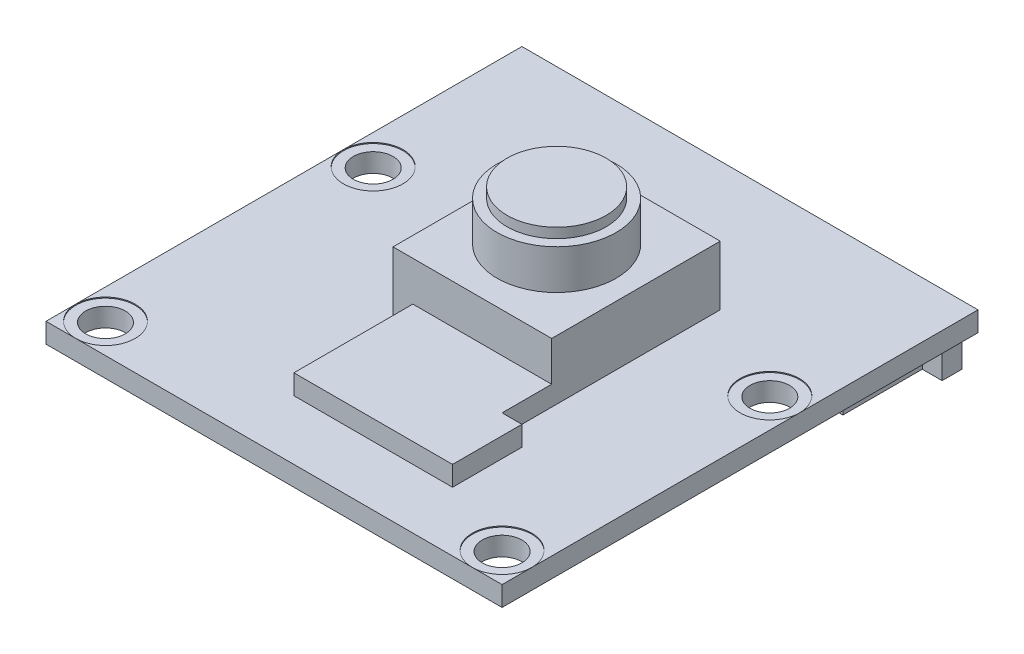
ISO-10303-21;
HEADER;
FILE_DESCRIPTION(('STEP AP214'),'2;1');
FILE_NAME('part.step','',(''),(''),'','','');
FILE_SCHEMA(('AUTOMOTIVE_DESIGN { 1 0 10303 214 1 1 1 1 }'));
ENDSEC;
DATA;
#1=APPLICATION_CONTEXT('core data for automotive mechanical design processes');
#2=APPLICATION_PROTOCOL_DEFINITION('international standard','automotive_design',2000,#1);
#3=PRODUCT_CONTEXT('',#1,'mechanical');
#4=PRODUCT('Part','Part','',(#3));
#5=PRODUCT_RELATED_PRODUCT_CATEGORY('part','',(#4));
#6=PRODUCT_DEFINITION_FORMATION('','',#4);
#7=PRODUCT_DEFINITION_CONTEXT('part definition',#1,'design');
#8=PRODUCT_DEFINITION('design','',#6,#7);
#9=PRODUCT_DEFINITION_SHAPE('','',#8);
#10=(LENGTH_UNIT() NAMED_UNIT(*) SI_UNIT(.MILLI.,.METRE.));
#11=(NAMED_UNIT(*) PLANE_ANGLE_UNIT() SI_UNIT($,.RADIAN.));
#12=(NAMED_UNIT(*) SI_UNIT($,.STERADIAN.) SOLID_ANGLE_UNIT());
#13=UNCERTAINTY_MEASURE_WITH_UNIT(LENGTH_MEASURE(1.E-05),#10,'distance_accuracy_value','');
#14=(GEOMETRIC_REPRESENTATION_CONTEXT(3) GLOBAL_UNCERTAINTY_ASSIGNED_CONTEXT((#13)) GLOBAL_UNIT_ASSIGNED_CONTEXT((#10,
#11,#12)) REPRESENTATION_CONTEXT('',''));
#15=CARTESIAN_POINT('',(0.,0.,0.));
#16=DIRECTION('',(0.,0.,1.));
#17=DIRECTION('',(1.,0.,0.));
#18=AXIS2_PLACEMENT_3D('',#15,#16,#17);
#19=CARTESIAN_POINT('',(21.1997439515811,0.01,-19.));
#20=DIRECTION('',(0.,0.,1.));
#21=DIRECTION('',(-1.,0.,0.));
#22=AXIS2_PLACEMENT_3D('',#19,#20,#21);
#23=PLANE('',#22);
#24=DIRECTION('',(-1.,0.,0.));
#25=VECTOR('',#24,1.);
#26=CARTESIAN_POINT('',(11.5948719757906,-2.,-19.));
#27=LINE('',#26,#25);
#28=CARTESIAN_POINT('',(21.1897439515812,-2.,-19.));
#29=VERTEX_POINT('',#28);
#30=CARTESIAN_POINT('',(1.68974395158116,-2.,-19.));
#31=VERTEX_POINT('',#30);
#32=EDGE_CURVE('P0_E118',#29,#31,#27,.T.);
#33=ORIENTED_EDGE('',*,*,#32,.F.);
#34=DIRECTION('',(0.,-1.,0.));
#35=VECTOR('',#34,1.);
#36=CARTESIAN_POINT('',(21.1897439515812,-1.,-19.));
#37=LINE('',#36,#35);
#38=CARTESIAN_POINT('',(21.1897439515812,0.,-19.));
#39=VERTEX_POINT('',#38);
#40=EDGE_CURVE('P0_E90',#39,#29,#37,.T.);
#41=ORIENTED_EDGE('',*,*,#40,.F.);
#42=DIRECTION('',(1.,0.,0.));
#43=VECTOR('',#42,1.);
#44=CARTESIAN_POINT('',(11.5948719757906,0.,-19.));
#45=LINE('',#44,#43);
#46=CARTESIAN_POINT('',(1.68974395158115,0.,-19.));
#47=VERTEX_POINT('',#46);
#48=EDGE_CURVE('P0_E96',#47,#39,#45,.T.);
#49=ORIENTED_EDGE('',*,*,#48,.F.);
#50=DIRECTION('',(0.,1.,0.));
#51=VECTOR('',#50,1.);
#52=CARTESIAN_POINT('',(1.68974395158116,-1.,-19.));
#53=LINE('',#52,#51);
#54=EDGE_CURVE('P0_E20',#31,#47,#53,.T.);
#55=ORIENTED_EDGE('',*,*,#54,.F.);
#56=EDGE_LOOP('',(#33,#41,#49,#55));
#57=FACE_BOUND('',#56,.T.);
#58=ADVANCED_FACE('P0_F16',(#57),#23,.T.);
#59=CARTESIAN_POINT('',(1.68974395158116,0.01,-18.99));
#60=DIRECTION('',(-1.,0.,0.));
#61=DIRECTION('',(0.,0.,-1.));
#62=AXIS2_PLACEMENT_3D('',#59,#60,#61);
#63=PLANE('',#62);
#64=DIRECTION('',(0.,0.,-1.));
#65=VECTOR('',#64,1.);
#66=CARTESIAN_POINT('',(1.68974395158116,-2.,-21.5));
#67=LINE('',#66,#65);
#68=CARTESIAN_POINT('',(1.68974395158116,-2.,-23.));
#69=VERTEX_POINT('',#68);
#70=EDGE_CURVE('P0_E120',#31,#69,#67,.T.);
#71=ORIENTED_EDGE('',*,*,#70,.F.);
#72=ORIENTED_EDGE('',*,*,#54,.T.);
#73=DIRECTION('',(0.,0.,1.));
#74=VECTOR('',#73,1.);
#75=CARTESIAN_POINT('',(1.68974395158115,0.,-21.5));
#76=LINE('',#75,#74);
#77=CARTESIAN_POINT('',(1.68974395158115,0.,-23.));
#78=VERTEX_POINT('',#77);
#79=EDGE_CURVE('P0_E92',#78,#47,#76,.T.);
#80=ORIENTED_EDGE('',*,*,#79,.F.);
#81=DIRECTION('',(0.,1.,0.));
#82=VECTOR('',#81,1.);
#83=CARTESIAN_POINT('',(1.68974395158116,-1.,-23.));
#84=LINE('',#83,#82);
#85=EDGE_CURVE('P0_E82',#69,#78,#84,.T.);
#86=ORIENTED_EDGE('',*,*,#85,.F.);
#87=EDGE_LOOP('',(#71,#72,#80,#86));
#88=FACE_BOUND('',#87,.T.);
#89=ADVANCED_FACE('P0_F93',(#88),#63,.T.);
#90=CARTESIAN_POINT('',(1.69974395158116,0.01,-23.));
#91=DIRECTION('',(0.,0.,1.));
#92=DIRECTION('',(-1.,0.,0.));
#93=AXIS2_PLACEMENT_3D('',#90,#91,#92);
#94=PLANE('',#93);
#95=DIRECTION('',(-1.,0.,0.));
#96=VECTOR('',#95,1.);
#97=CARTESIAN_POINT('',(11.5948719757906,-2.,-23.));
#98=LINE('',#97,#96);
#99=CARTESIAN_POINT('',(1.,-2.,-23.));
#100=VERTEX_POINT('',#99);
#101=EDGE_CURVE('P0_E88',#69,#100,#98,.T.);
#102=ORIENTED_EDGE('',*,*,#101,.F.);
#103=ORIENTED_EDGE('',*,*,#85,.T.);
#104=DIRECTION('',(1.,0.,0.));
#105=VECTOR('',#104,1.);
#106=CARTESIAN_POINT('',(11.5948719757906,0.,-23.));
#107=LINE('',#106,#105);
#108=CARTESIAN_POINT('',(1.,0.,-23.));
#109=VERTEX_POINT('',#108);
#110=EDGE_CURVE('P0_E86',#109,#78,#107,.T.);
#111=ORIENTED_EDGE('',*,*,#110,.F.);
#112=DIRECTION('',(0.,1.,0.));
#113=VECTOR('',#112,1.);
#114=CARTESIAN_POINT('',(1.,-1.,-23.));
#115=LINE('',#114,#113);
#116=EDGE_CURVE('P0_E137',#100,#109,#115,.T.);
#117=ORIENTED_EDGE('',*,*,#116,.F.);
#118=EDGE_LOOP('',(#102,#103,#111,#117));
#119=FACE_BOUND('',#118,.T.);
#120=ADVANCED_FACE('P0_F83',(#119),#94,.T.);
#121=CARTESIAN_POINT('',(21.1897439515812,0.01,-23.01));
#122=DIRECTION('',(1.,0.,0.));
#123=DIRECTION('',(0.,0.,1.));
#124=AXIS2_PLACEMENT_3D('',#121,#122,#123);
#125=PLANE('',#124);
#126=DIRECTION('',(0.,0.,1.));
#127=VECTOR('',#126,1.);
#128=CARTESIAN_POINT('',(21.1897439515812,-2.,-21.5));
#129=LINE('',#128,#127);
#130=CARTESIAN_POINT('',(21.1897439515812,-2.,-23.));
#131=VERTEX_POINT('',#130);
#132=EDGE_CURVE('P0_E113',#131,#29,#129,.T.);
#133=ORIENTED_EDGE('',*,*,#132,.F.);
#134=DIRECTION('',(0.,-1.,0.));
#135=VECTOR('',#134,1.);
#136=CARTESIAN_POINT('',(21.1897439515812,-1.,-23.));
#137=LINE('',#136,#135);
#138=CARTESIAN_POINT('',(21.1897439515812,0.,-23.));
#139=VERTEX_POINT('',#138);
#140=EDGE_CURVE('P0_E133',#139,#131,#137,.T.);
#141=ORIENTED_EDGE('',*,*,#140,.F.);
#142=DIRECTION('',(0.,0.,-1.));
#143=VECTOR('',#142,1.);
#144=CARTESIAN_POINT('',(21.1897439515812,0.,-21.5));
#145=LINE('',#144,#143);
#146=EDGE_CURVE('P0_E115',#39,#139,#145,.T.);
#147=ORIENTED_EDGE('',*,*,#146,.F.);
#148=ORIENTED_EDGE('',*,*,#40,.T.);
#149=EDGE_LOOP('',(#133,#141,#147,#148));
#150=FACE_BOUND('',#149,.T.);
#151=ADVANCED_FACE('P0_F110',(#150),#125,.T.);
#152=CARTESIAN_POINT('',(22.1997439515812,0.,-24.01));
#153=DIRECTION('',(0.,1.,0.));
#154=DIRECTION('',(-1.,0.,0.));
#155=AXIS2_PLACEMENT_3D('',#152,#153,#154);
#156=PLANE('',#155);
#157=ORIENTED_EDGE('',*,*,#48,.T.);
#158=ORIENTED_EDGE('',*,*,#146,.T.);
#159=DIRECTION('',(-1.,0.,0.));
#160=VECTOR('',#159,1.);
#161=CARTESIAN_POINT('',(21.6897439515812,0.,-23.));
#162=LINE('',#161,#160);
#163=CARTESIAN_POINT('',(22.1897439515812,0.,-23.));
#164=VERTEX_POINT('',#163);
#165=EDGE_CURVE('P0_E131',#164,#139,#162,.T.);
#166=ORIENTED_EDGE('',*,*,#165,.F.);
#167=DIRECTION('',(0.,0.,-1.));
#168=VECTOR('',#167,1.);
#169=CARTESIAN_POINT('',(22.1897439515812,0.,-21.5));
#170=LINE('',#169,#168);
#171=CARTESIAN_POINT('',(22.1897439515812,0.,-24.));
#172=VERTEX_POINT('',#171);
#173=EDGE_CURVE('P0_E102',#164,#172,#170,.T.);
#174=ORIENTED_EDGE('',*,*,#173,.T.);
#175=DIRECTION('',(1.,0.,0.));
#176=VECTOR('',#175,1.);
#177=CARTESIAN_POINT('',(11.5948719757906,0.,-24.));
#178=LINE('',#177,#176);
#179=CARTESIAN_POINT('',(1.,0.,-24.));
#180=VERTEX_POINT('',#179);
#181=EDGE_CURVE('P0_E159',#180,#172,#178,.T.);
#182=ORIENTED_EDGE('',*,*,#181,.F.);
#183=DIRECTION('',(0.,0.,-1.));
#184=VECTOR('',#183,1.);
#185=CARTESIAN_POINT('',(1.,0.,-23.5));
#186=LINE('',#185,#184);
#187=EDGE_CURVE('P0_E100',#109,#180,#186,.T.);
#188=ORIENTED_EDGE('',*,*,#187,.F.);
#189=ORIENTED_EDGE('',*,*,#110,.T.);
#190=ORIENTED_EDGE('',*,*,#79,.T.);
#191=EDGE_LOOP('',(#157,#158,#166,#174,#182,#188,#189,#190));
#192=FACE_BOUND('',#191,.T.);
#193=ADVANCED_FACE('P0_F98',(#192),#156,.T.);
#194=CARTESIAN_POINT('',(0.990000000000003,-2.,-18.99));
#195=DIRECTION('',(0.,-1.,0.));
#196=DIRECTION('',(0.,0.,-1.));
#197=AXIS2_PLACEMENT_3D('',#194,#195,#196);
#198=PLANE('',#197);
#199=DIRECTION('',(-1.,0.,0.));
#200=VECTOR('',#199,1.);
#201=CARTESIAN_POINT('',(11.5948719757906,-2.,-24.));
#202=LINE('',#201,#200);
#203=CARTESIAN_POINT('',(22.1897439515812,-2.,-24.));
#204=VERTEX_POINT('',#203);
#205=CARTESIAN_POINT('',(1.,-2.,-24.));
#206=VERTEX_POINT('',#205);
#207=EDGE_CURVE('P0_E155',#204,#206,#202,.T.);
#208=ORIENTED_EDGE('',*,*,#207,.F.);
#209=DIRECTION('',(0.,0.,1.));
#210=VECTOR('',#209,1.);
#211=CARTESIAN_POINT('',(22.1897439515812,-2.,-21.5));
#212=LINE('',#211,#210);
#213=CARTESIAN_POINT('',(22.1897439515812,-2.,-23.));
#214=VERTEX_POINT('',#213);
#215=EDGE_CURVE('P0_E34',#204,#214,#212,.T.);
#216=ORIENTED_EDGE('',*,*,#215,.T.);
#217=DIRECTION('',(1.,0.,0.));
#218=VECTOR('',#217,1.);
#219=CARTESIAN_POINT('',(21.6897439515812,-2.,-23.));
#220=LINE('',#219,#218);
#221=EDGE_CURVE('P0_E124',#131,#214,#220,.T.);
#222=ORIENTED_EDGE('',*,*,#221,.F.);
#223=ORIENTED_EDGE('',*,*,#132,.T.);
#224=ORIENTED_EDGE('',*,*,#32,.T.);
#225=ORIENTED_EDGE('',*,*,#70,.T.);
#226=ORIENTED_EDGE('',*,*,#101,.T.);
#227=DIRECTION('',(0.,0.,1.));
#228=VECTOR('',#227,1.);
#229=CARTESIAN_POINT('',(1.,-2.,-23.5));
#230=LINE('',#229,#228);
#231=EDGE_CURVE('P0_E139',#206,#100,#230,.T.);
#232=ORIENTED_EDGE('',*,*,#231,.F.);
#233=EDGE_LOOP('',(#208,#216,#222,#223,#224,#225,#226,#232));
#234=FACE_BOUND('',#233,.T.);
#235=ADVANCED_FACE('P0_F122',(#234),#198,.T.);
#236=CARTESIAN_POINT('',(1.,0.01,-22.99));
#237=DIRECTION('',(-1.,0.,0.));
#238=DIRECTION('',(0.,0.,-1.));
#239=AXIS2_PLACEMENT_3D('',#236,#237,#238);
#240=PLANE('',#239);
#241=ORIENTED_EDGE('',*,*,#231,.T.);
#242=ORIENTED_EDGE('',*,*,#116,.T.);
#243=ORIENTED_EDGE('',*,*,#187,.T.);
#244=DIRECTION('',(0.,1.,0.));
#245=VECTOR('',#244,1.);
#246=CARTESIAN_POINT('',(1.,-1.,-24.));
#247=LINE('',#246,#245);
#248=EDGE_CURVE('P0_E151',#206,#180,#247,.T.);
#249=ORIENTED_EDGE('',*,*,#248,.F.);
#250=EDGE_LOOP('',(#241,#242,#243,#249));
#251=FACE_BOUND('',#250,.T.);
#252=ADVANCED_FACE('P0_F149',(#251),#240,.T.);
#253=CARTESIAN_POINT('',(22.1997439515812,0.01,-23.));
#254=DIRECTION('',(0.,0.,1.));
#255=DIRECTION('',(-1.,0.,0.));
#256=AXIS2_PLACEMENT_3D('',#253,#254,#255);
#257=PLANE('',#256);
#258=ORIENTED_EDGE('',*,*,#221,.T.);
#259=DIRECTION('',(0.,-1.,0.));
#260=VECTOR('',#259,1.);
#261=CARTESIAN_POINT('',(22.1897439515812,-1.,-23.));
#262=LINE('',#261,#260);
#263=EDGE_CURVE('P0_E26',#164,#214,#262,.T.);
#264=ORIENTED_EDGE('',*,*,#263,.F.);
#265=ORIENTED_EDGE('',*,*,#165,.T.);
#266=ORIENTED_EDGE('',*,*,#140,.T.);
#267=EDGE_LOOP('',(#258,#264,#265,#266));
#268=FACE_BOUND('',#267,.T.);
#269=ADVANCED_FACE('P0_F136',(#268),#257,.T.);
#270=CARTESIAN_POINT('',(0.99,0.01,-24.));
#271=DIRECTION('',(0.,0.,-1.));
#272=DIRECTION('',(1.,0.,0.));
#273=AXIS2_PLACEMENT_3D('',#270,#271,#272);
#274=PLANE('',#273);
#275=ORIENTED_EDGE('',*,*,#207,.T.);
#276=ORIENTED_EDGE('',*,*,#248,.T.);
#277=ORIENTED_EDGE('',*,*,#181,.T.);
#278=DIRECTION('',(0.,1.,0.));
#279=VECTOR('',#278,1.);
#280=CARTESIAN_POINT('',(22.1897439515812,-1.,-24.));
#281=LINE('',#280,#279);
#282=EDGE_CURVE('P0_E10',#204,#172,#281,.T.);
#283=ORIENTED_EDGE('',*,*,#282,.F.);
#284=EDGE_LOOP('',(#275,#276,#277,#283));
#285=FACE_BOUND('',#284,.T.);
#286=ADVANCED_FACE('P0_F158',(#285),#274,.T.);
#287=CARTESIAN_POINT('',(22.1897439515812,0.01,-24.01));
#288=DIRECTION('',(1.,0.,0.));
#289=DIRECTION('',(0.,0.,1.));
#290=AXIS2_PLACEMENT_3D('',#287,#288,#289);
#291=PLANE('',#290);
#292=ORIENTED_EDGE('',*,*,#215,.F.);
#293=ORIENTED_EDGE('',*,*,#282,.T.);
#294=ORIENTED_EDGE('',*,*,#173,.F.);
#295=ORIENTED_EDGE('',*,*,#263,.T.);
#296=EDGE_LOOP('',(#292,#293,#294,#295));
#297=FACE_BOUND('',#296,.T.);
#298=ADVANCED_FACE('P0_F18',(#297),#291,.T.);
#299=CLOSED_SHELL('',(#58,#89,#120,#151,#193,#235,#252,#269,#286,#298));
#300=MANIFOLD_SOLID_BREP('P0_B1',#299);
#301=CARTESIAN_POINT('',(15.01,6.50000000000001,-15.76));
#302=DIRECTION('',(0.,1.,0.));
#303=DIRECTION('',(-1.,0.,0.));
#304=AXIS2_PLACEMENT_3D('',#301,#302,#303);
#305=PLANE('',#304);
#306=CARTESIAN_POINT('',(12.5,6.50000000000001,-13.25));
#307=DIRECTION('',(0.,-1.,0.));
#308=DIRECTION('',(0.,0.,-1.));
#309=AXIS2_PLACEMENT_3D('',#306,#307,#308);
#310=CIRCLE('',#309,2.49999999999999);
#311=CARTESIAN_POINT('',(12.5,6.50000000000001,-15.75));
#312=VERTEX_POINT('',#311);
#313=EDGE_CURVE('P1_E21',#312,#312,#310,.T.);
#314=ORIENTED_EDGE('',*,*,#313,.F.);
#315=EDGE_LOOP('',(#314));
#316=FACE_BOUND('',#315,.T.);
#317=ADVANCED_FACE('P1_F17',(#316),#305,.T.);
#318=CARTESIAN_POINT('',(12.5,6.50000000000001,-13.25));
#319=DIRECTION('',(0.,-1.,0.));
#320=DIRECTION('',(0.,0.,-1.));
#321=AXIS2_PLACEMENT_3D('',#318,#319,#320);
#322=CYLINDRICAL_SURFACE('',#321,2.49999999999999);
#323=CARTESIAN_POINT('',(12.5,6.,-13.25));
#324=DIRECTION('',(0.,-1.,0.));
#325=DIRECTION('',(0.,0.,-1.));
#326=AXIS2_PLACEMENT_3D('',#323,#324,#325);
#327=CIRCLE('',#326,2.49999999999999);
#328=CARTESIAN_POINT('',(12.5,6.,-15.75));
#329=VERTEX_POINT('',#328);
#330=EDGE_CURVE('P1_E305',#329,#329,#327,.T.);
#331=ORIENTED_EDGE('',*,*,#330,.F.);
#332=EDGE_LOOP('',(#331));
#333=FACE_BOUND('',#332,.T.);
#334=ORIENTED_EDGE('',*,*,#313,.T.);
#335=EDGE_LOOP('',(#334));
#336=FACE_BOUND('',#335,.T.);
#337=ADVANCED_FACE('P1_F312',(#333,#336),#322,.T.);
#338=CARTESIAN_POINT('',(15.51,6.,-16.26));
#339=DIRECTION('',(0.,1.,0.));
#340=DIRECTION('',(-1.,0.,0.));
#341=AXIS2_PLACEMENT_3D('',#338,#339,#340);
#342=PLANE('',#341);
#343=ORIENTED_EDGE('',*,*,#330,.T.);
#344=EDGE_LOOP('',(#343));
#345=FACE_BOUND('',#344,.T.);
#346=CARTESIAN_POINT('',(12.5,6.,-13.25));
#347=DIRECTION('',(0.,-1.,0.));
#348=DIRECTION('',(0.,0.,-1.));
#349=AXIS2_PLACEMENT_3D('',#346,#347,#348);
#350=CIRCLE('',#349,3.);
#351=CARTESIAN_POINT('',(12.5,6.,-16.25));
#352=VERTEX_POINT('',#351);
#353=EDGE_CURVE('P1_E264',#352,#352,#350,.T.);
#354=ORIENTED_EDGE('',*,*,#353,.F.);
#355=EDGE_LOOP('',(#354));
#356=FACE_BOUND('',#355,.T.);
#357=ADVANCED_FACE('P1_F320',(#345,#356),#342,.T.);
#358=CARTESIAN_POINT('',(12.5,6.,-13.25));
#359=DIRECTION('',(0.,-1.,0.));
#360=DIRECTION('',(0.,0.,-1.));
#361=AXIS2_PLACEMENT_3D('',#358,#359,#360);
#362=CYLINDRICAL_SURFACE('',#361,3.);
#363=CARTESIAN_POINT('',(12.5,4.,-13.25));
#364=DIRECTION('',(0.,-1.,0.));
#365=DIRECTION('',(0.,0.,-1.));
#366=AXIS2_PLACEMENT_3D('',#363,#364,#365);
#367=CIRCLE('',#366,3.);
#368=CARTESIAN_POINT('',(12.5,4.,-16.25));
#369=VERTEX_POINT('',#368);
#370=EDGE_CURVE('P1_E258',#369,#369,#367,.T.);
#371=ORIENTED_EDGE('',*,*,#370,.F.);
#372=EDGE_LOOP('',(#371));
#373=FACE_BOUND('',#372,.T.);
#374=ORIENTED_EDGE('',*,*,#353,.T.);
#375=EDGE_LOOP('',(#374));
#376=FACE_BOUND('',#375,.T.);
#377=ADVANCED_FACE('P1_F549',(#373,#376),#362,.T.);
#378=CARTESIAN_POINT('',(9.48999999999999,2.,-9.01));
#379=DIRECTION('',(0.,1.,0.));
#380=DIRECTION('',(0.,0.,1.));
#381=AXIS2_PLACEMENT_3D('',#378,#379,#380);
#382=PLANE('',#381);
#383=DIRECTION('',(1.,0.,0.));
#384=VECTOR('',#383,1.);
#385=CARTESIAN_POINT('',(17.,2.,-6.50000000000001));
#386=LINE('',#385,#384);
#387=CARTESIAN_POINT('',(16.5,2.,-6.50000000000001));
#388=VERTEX_POINT('',#387);
#389=CARTESIAN_POINT('',(17.5,2.,-6.50000000000001));
#390=VERTEX_POINT('',#389);
#391=EDGE_CURVE('P1_E245',#388,#390,#386,.T.);
#392=ORIENTED_EDGE('',*,*,#391,.F.);
#393=DIRECTION('',(0.,0.,1.));
#394=VECTOR('',#393,1.);
#395=CARTESIAN_POINT('',(16.5,2.,-12.));
#396=LINE('',#395,#394);
#397=CARTESIAN_POINT('',(16.5,2.,-8.99999999999999));
#398=VERTEX_POINT('',#397);
#399=EDGE_CURVE('P1_E250',#398,#388,#396,.T.);
#400=ORIENTED_EDGE('',*,*,#399,.F.);
#401=DIRECTION('',(1.,0.,0.));
#402=VECTOR('',#401,1.);
#403=CARTESIAN_POINT('',(12.5,2.,-8.99999999999999));
#404=LINE('',#403,#402);
#405=CARTESIAN_POINT('',(9.5,2.,-8.99999999999999));
#406=VERTEX_POINT('',#405);
#407=EDGE_CURVE('P1_E263',#406,#398,#404,.T.);
#408=ORIENTED_EDGE('',*,*,#407,.F.);
#409=DIRECTION('',(0.,0.,-1.));
#410=VECTOR('',#409,1.);
#411=CARTESIAN_POINT('',(9.5,2.,-6.));
#412=LINE('',#411,#410);
#413=CARTESIAN_POINT('',(9.5,2.,-2.99999999999999));
#414=VERTEX_POINT('',#413);
#415=EDGE_CURVE('P1_E229',#414,#406,#412,.T.);
#416=ORIENTED_EDGE('',*,*,#415,.F.);
#417=DIRECTION('',(-1.,0.,0.));
#418=VECTOR('',#417,1.);
#419=CARTESIAN_POINT('',(13.5,2.,-2.99999999999999));
#420=LINE('',#419,#418);
#421=CARTESIAN_POINT('',(17.5,2.,-2.99999999999999));
#422=VERTEX_POINT('',#421);
#423=EDGE_CURVE('P1_E235',#422,#414,#420,.T.);
#424=ORIENTED_EDGE('',*,*,#423,.F.);
#425=DIRECTION('',(0.,0.,1.));
#426=VECTOR('',#425,1.);
#427=CARTESIAN_POINT('',(17.5,2.,-4.75));
#428=LINE('',#427,#426);
#429=EDGE_CURVE('P1_E240',#390,#422,#428,.T.);
#430=ORIENTED_EDGE('',*,*,#429,.F.);
#431=EDGE_LOOP('',(#392,#400,#408,#416,#424,#430));
#432=FACE_BOUND('',#431,.T.);
#433=ADVANCED_FACE('P1_F432',(#432),#382,.T.);
#434=CARTESIAN_POINT('',(8.49,0.99,-8.99999999999999));
#435=DIRECTION('',(0.,0.,1.));
#436=DIRECTION('',(1.,0.,0.));
#437=AXIS2_PLACEMENT_3D('',#434,#435,#436);
#438=PLANE('',#437);
#439=DIRECTION('',(1.,0.,0.));
#440=VECTOR('',#439,1.);
#441=CARTESIAN_POINT('',(12.5,1.,-9.));
#442=LINE('',#441,#440);
#443=CARTESIAN_POINT('',(8.49999999999999,1.,-8.99999999999999));
#444=VERTEX_POINT('',#443);
#445=CARTESIAN_POINT('',(9.5,1.,-8.99999999999999));
#446=VERTEX_POINT('',#445);
#447=EDGE_CURVE('P1_E261',#444,#446,#442,.T.);
#448=ORIENTED_EDGE('',*,*,#447,.T.);
#449=DIRECTION('',(0.,-1.,0.));
#450=VECTOR('',#449,1.);
#451=CARTESIAN_POINT('',(9.5,1.5,-8.99999999999999));
#452=LINE('',#451,#450);
#453=EDGE_CURVE('P1_E226',#406,#446,#452,.T.);
#454=ORIENTED_EDGE('',*,*,#453,.F.);
#455=ORIENTED_EDGE('',*,*,#407,.T.);
#456=DIRECTION('',(0.,-1.,0.));
#457=VECTOR('',#456,1.);
#458=CARTESIAN_POINT('',(16.5,2.50000000000001,-8.99999999999999));
#459=LINE('',#458,#457);
#460=CARTESIAN_POINT('',(16.5,4.,-8.99999999999999));
#461=VERTEX_POINT('',#460);
#462=EDGE_CURVE('P1_E252',#461,#398,#459,.T.);
#463=ORIENTED_EDGE('',*,*,#462,.F.);
#464=DIRECTION('',(1.,0.,0.));
#465=VECTOR('',#464,1.);
#466=CARTESIAN_POINT('',(12.5,4.,-8.99999999999999));
#467=LINE('',#466,#465);
#468=CARTESIAN_POINT('',(8.49999999999999,4.,-8.99999999999999));
#469=VERTEX_POINT('',#468);
#470=EDGE_CURVE('P1_E259',#469,#461,#467,.T.);
#471=ORIENTED_EDGE('',*,*,#470,.F.);
#472=DIRECTION('',(0.,1.,0.));
#473=VECTOR('',#472,1.);
#474=CARTESIAN_POINT('',(8.49999999999999,2.50000000000001,-8.99999999999999));
#475=LINE('',#474,#473);
#476=EDGE_CURVE('P1_E223',#444,#469,#475,.T.);
#477=ORIENTED_EDGE('',*,*,#476,.F.);
#478=EDGE_LOOP('',(#448,#454,#455,#463,#471,#477));
#479=FACE_BOUND('',#478,.T.);
#480=ADVANCED_FACE('P1_F417',(#479),#438,.T.);
#481=CARTESIAN_POINT('',(8.49,4.,-17.51));
#482=DIRECTION('',(0.,1.,0.));
#483=DIRECTION('',(0.,0.,1.));
#484=AXIS2_PLACEMENT_3D('',#481,#482,#483);
#485=PLANE('',#484);
#486=ORIENTED_EDGE('',*,*,#370,.T.);
#487=EDGE_LOOP('',(#486));
#488=FACE_BOUND('',#487,.T.);
#489=ORIENTED_EDGE('',*,*,#470,.T.);
#490=DIRECTION('',(0.,0.,1.));
#491=VECTOR('',#490,1.);
#492=CARTESIAN_POINT('',(16.5,4.,-12.));
#493=LINE('',#492,#491);
#494=CARTESIAN_POINT('',(16.5,4.,-17.5));
#495=VERTEX_POINT('',#494);
#496=EDGE_CURVE('P1_E255',#495,#461,#493,.T.);
#497=ORIENTED_EDGE('',*,*,#496,.F.);
#498=DIRECTION('',(1.,0.,0.));
#499=VECTOR('',#498,1.);
#500=CARTESIAN_POINT('',(12.5,4.,-17.5));
#501=LINE('',#500,#499);
#502=CARTESIAN_POINT('',(8.49999999999999,4.,-17.5));
#503=VERTEX_POINT('',#502);
#504=EDGE_CURVE('P1_E215',#503,#495,#501,.T.);
#505=ORIENTED_EDGE('',*,*,#504,.F.);
#506=DIRECTION('',(0.,0.,-1.));
#507=VECTOR('',#506,1.);
#508=CARTESIAN_POINT('',(8.49999999999999,4.,-13.25));
#509=LINE('',#508,#507);
#510=EDGE_CURVE('P1_E221',#469,#503,#509,.T.);
#511=ORIENTED_EDGE('',*,*,#510,.F.);
#512=EDGE_LOOP('',(#489,#497,#505,#511));
#513=FACE_BOUND('',#512,.T.);
#514=ADVANCED_FACE('P1_F421',(#488,#513),#485,.T.);
#515=CARTESIAN_POINT('',(1.5,1.,-15.));
#516=DIRECTION('',(0.,-1.,0.));
#517=DIRECTION('',(0.,0.,-1.));
#518=AXIS2_PLACEMENT_3D('',#515,#516,#517);
#519=CYLINDRICAL_SURFACE('',#518,1.49999999999999);
#520=CARTESIAN_POINT('',(1.5,0.95,-15.));
#521=DIRECTION('',(0.,-1.,0.));
#522=DIRECTION('',(0.,0.,-1.));
#523=AXIS2_PLACEMENT_3D('',#520,#521,#522);
#524=CIRCLE('',#523,1.49999999999999);
#525=CARTESIAN_POINT('',(1.5,0.95,-16.5));
#526=VERTEX_POINT('',#525);
#527=EDGE_CURVE('P1_E294',#526,#526,#524,.F.);
#528=ORIENTED_EDGE('',*,*,#527,.F.);
#529=EDGE_LOOP('',(#528));
#530=FACE_BOUND('',#529,.T.);
#531=CARTESIAN_POINT('',(1.5,1.,-15.));
#532=DIRECTION('',(0.,-1.,0.));
#533=DIRECTION('',(0.,0.,-1.));
#534=AXIS2_PLACEMENT_3D('',#531,#532,#533);
#535=CIRCLE('',#534,1.49999999999999);
#536=CARTESIAN_POINT('',(0.,1.,-15.));
#537=VERTEX_POINT('',#536);
#538=EDGE_CURVE('P1_E122',#537,#537,#535,.T.);
#539=ORIENTED_EDGE('',*,*,#538,.F.);
#540=EDGE_LOOP('',(#539));
#541=FACE_BOUND('',#540,.T.);
#542=ADVANCED_FACE('P1_F423',(#530,#541),#519,.F.);
#543=CARTESIAN_POINT('',(21.5,1.,-15.));
#544=DIRECTION('',(0.,-1.,0.));
#545=DIRECTION('',(0.,0.,-1.));
#546=AXIS2_PLACEMENT_3D('',#543,#544,#545);
#547=CYLINDRICAL_SURFACE('',#546,1.49999999999999);
#548=CARTESIAN_POINT('',(21.5,0.95,-15.));
#549=DIRECTION('',(0.,-1.,0.));
#550=DIRECTION('',(0.,0.,-1.));
#551=AXIS2_PLACEMENT_3D('',#548,#549,#550);
#552=CIRCLE('',#551,1.49999999999999);
#553=CARTESIAN_POINT('',(21.5,0.95,-16.5));
#554=VERTEX_POINT('',#553);
#555=EDGE_CURVE('P1_E297',#554,#554,#552,.F.);
#556=ORIENTED_EDGE('',*,*,#555,.F.);
#557=EDGE_LOOP('',(#556));
#558=FACE_BOUND('',#557,.T.);
#559=CARTESIAN_POINT('',(21.5,1.,-15.));
#560=DIRECTION('',(0.,-1.,0.));
#561=DIRECTION('',(0.,0.,-1.));
#562=AXIS2_PLACEMENT_3D('',#559,#560,#561);
#563=CIRCLE('',#562,1.49999999999999);
#564=CARTESIAN_POINT('',(23.,1.,-15.));
#565=VERTEX_POINT('',#564);
#566=EDGE_CURVE('P1_E115',#565,#565,#563,.T.);
#567=ORIENTED_EDGE('',*,*,#566,.F.);
#568=EDGE_LOOP('',(#567));
#569=FACE_BOUND('',#568,.T.);
#570=ADVANCED_FACE('P1_F117',(#558,#569),#547,.F.);
#571=CARTESIAN_POINT('',(16.5,0.99,-6.49));
#572=DIRECTION('',(1.,0.,0.));
#573=DIRECTION('',(0.,0.,-1.));
#574=AXIS2_PLACEMENT_3D('',#571,#572,#573);
#575=PLANE('',#574);
#576=ORIENTED_EDGE('',*,*,#399,.T.);
#577=DIRECTION('',(0.,1.,0.));
#578=VECTOR('',#577,1.);
#579=CARTESIAN_POINT('',(16.5,1.5,-6.50000000000001));
#580=LINE('',#579,#578);
#581=CARTESIAN_POINT('',(16.5,1.,-6.50000000000001));
#582=VERTEX_POINT('',#581);
#583=EDGE_CURVE('P1_E247',#582,#388,#580,.T.);
#584=ORIENTED_EDGE('',*,*,#583,.F.);
#585=DIRECTION('',(0.,0.,1.));
#586=VECTOR('',#585,1.);
#587=CARTESIAN_POINT('',(16.5,1.,-12.));
#588=LINE('',#587,#586);
#589=CARTESIAN_POINT('',(16.5,1.,-17.5));
#590=VERTEX_POINT('',#589);
#591=EDGE_CURVE('P1_E121',#590,#582,#588,.T.);
#592=ORIENTED_EDGE('',*,*,#591,.F.);
#593=DIRECTION('',(0.,-1.,0.));
#594=VECTOR('',#593,1.);
#595=CARTESIAN_POINT('',(16.5,2.50000000000001,-17.5));
#596=LINE('',#595,#594);
#597=EDGE_CURVE('P1_E211',#495,#590,#596,.T.);
#598=ORIENTED_EDGE('',*,*,#597,.F.);
#599=ORIENTED_EDGE('',*,*,#496,.T.);
#600=ORIENTED_EDGE('',*,*,#462,.T.);
#601=EDGE_LOOP('',(#576,#584,#592,#598,#599,#600));
#602=FACE_BOUND('',#601,.T.);
#603=ADVANCED_FACE('P1_F398',(#602),#575,.T.);
#604=CARTESIAN_POINT('',(17.51,0.99,-6.50000000000001));
#605=DIRECTION('',(0.,0.,-1.));
#606=DIRECTION('',(-1.,0.,0.));
#607=AXIS2_PLACEMENT_3D('',#604,#605,#606);
#608=PLANE('',#607);
#609=ORIENTED_EDGE('',*,*,#391,.T.);
#610=DIRECTION('',(0.,1.,0.));
#611=VECTOR('',#610,1.);
#612=CARTESIAN_POINT('',(17.5,1.5,-6.50000000000001));
#613=LINE('',#612,#611);
#614=CARTESIAN_POINT('',(17.5,1.,-6.50000000000001));
#615=VERTEX_POINT('',#614);
#616=EDGE_CURVE('P1_E242',#615,#390,#613,.T.);
#617=ORIENTED_EDGE('',*,*,#616,.F.);
#618=DIRECTION('',(1.,0.,0.));
#619=VECTOR('',#618,1.);
#620=CARTESIAN_POINT('',(11.5,1.,-6.50000000000001));
#621=LINE('',#620,#619);
#622=EDGE_CURVE('P1_E167',#582,#615,#621,.T.);
#623=ORIENTED_EDGE('',*,*,#622,.F.);
#624=ORIENTED_EDGE('',*,*,#583,.T.);
#625=EDGE_LOOP('',(#609,#617,#623,#624));
#626=FACE_BOUND('',#625,.T.);
#627=ADVANCED_FACE('P1_F402',(#626),#608,.T.);
#628=CARTESIAN_POINT('',(17.5,0.99,-2.99));
#629=DIRECTION('',(1.,0.,0.));
#630=DIRECTION('',(0.,0.,-1.));
#631=AXIS2_PLACEMENT_3D('',#628,#629,#630);
#632=PLANE('',#631);
#633=ORIENTED_EDGE('',*,*,#429,.T.);
#634=DIRECTION('',(0.,1.,0.));
#635=VECTOR('',#634,1.);
#636=CARTESIAN_POINT('',(17.5,1.5,-2.99999999999999));
#637=LINE('',#636,#635);
#638=CARTESIAN_POINT('',(17.5,1.,-2.99999999999999));
#639=VERTEX_POINT('',#638);
#640=EDGE_CURVE('P1_E237',#639,#422,#637,.T.);
#641=ORIENTED_EDGE('',*,*,#640,.F.);
#642=DIRECTION('',(0.,0.,1.));
#643=VECTOR('',#642,1.);
#644=CARTESIAN_POINT('',(17.5,1.,-12.));
#645=LINE('',#644,#643);
#646=EDGE_CURVE('P1_E164',#615,#639,#645,.T.);
#647=ORIENTED_EDGE('',*,*,#646,.F.);
#648=ORIENTED_EDGE('',*,*,#616,.T.);
#649=EDGE_LOOP('',(#633,#641,#647,#648));
#650=FACE_BOUND('',#649,.T.);
#651=ADVANCED_FACE('P1_F406',(#650),#632,.T.);
#652=CARTESIAN_POINT('',(9.48999999999999,0.99,-2.99999999999999));
#653=DIRECTION('',(0.,0.,1.));
#654=DIRECTION('',(1.,0.,0.));
#655=AXIS2_PLACEMENT_3D('',#652,#653,#654);
#656=PLANE('',#655);
#657=ORIENTED_EDGE('',*,*,#423,.T.);
#658=DIRECTION('',(0.,1.,0.));
#659=VECTOR('',#658,1.);
#660=CARTESIAN_POINT('',(9.5,1.5,-2.99999999999999));
#661=LINE('',#660,#659);
#662=CARTESIAN_POINT('',(9.5,1.,-2.99999999999999));
#663=VERTEX_POINT('',#662);
#664=EDGE_CURVE('P1_E232',#663,#414,#661,.T.);
#665=ORIENTED_EDGE('',*,*,#664,.F.);
#666=DIRECTION('',(-1.,0.,0.));
#667=VECTOR('',#666,1.);
#668=CARTESIAN_POINT('',(11.5,1.,-2.99999999999998));
#669=LINE('',#668,#667);
#670=EDGE_CURVE('P1_E161',#639,#663,#669,.T.);
#671=ORIENTED_EDGE('',*,*,#670,.F.);
#672=ORIENTED_EDGE('',*,*,#640,.T.);
#673=EDGE_LOOP('',(#657,#665,#671,#672));
#674=FACE_BOUND('',#673,.T.);
#675=ADVANCED_FACE('P1_F410',(#674),#656,.T.);
#676=CARTESIAN_POINT('',(9.5,0.99,-9.01));
#677=DIRECTION('',(-1.,0.,0.));
#678=DIRECTION('',(0.,0.,1.));
#679=AXIS2_PLACEMENT_3D('',#676,#677,#678);
#680=PLANE('',#679);
#681=ORIENTED_EDGE('',*,*,#415,.T.);
#682=ORIENTED_EDGE('',*,*,#453,.T.);
#683=DIRECTION('',(0.,0.,-1.));
#684=VECTOR('',#683,1.);
#685=CARTESIAN_POINT('',(9.5,1.,-12.));
#686=LINE('',#685,#684);
#687=EDGE_CURVE('P1_E158',#663,#446,#686,.T.);
#688=ORIENTED_EDGE('',*,*,#687,.F.);
#689=ORIENTED_EDGE('',*,*,#664,.T.);
#690=EDGE_LOOP('',(#681,#682,#688,#689));
#691=FACE_BOUND('',#690,.T.);
#692=ADVANCED_FACE('P1_F413',(#691),#680,.T.);
#693=CARTESIAN_POINT('',(8.49999999999999,0.99,-17.51));
#694=DIRECTION('',(-1.,0.,0.));
#695=DIRECTION('',(0.,0.,1.));
#696=AXIS2_PLACEMENT_3D('',#693,#694,#695);
#697=PLANE('',#696);
#698=ORIENTED_EDGE('',*,*,#510,.T.);
#699=DIRECTION('',(0.,1.,0.));
#700=VECTOR('',#699,1.);
#701=CARTESIAN_POINT('',(8.49999999999999,2.50000000000001,-17.5));
#702=LINE('',#701,#700);
#703=CARTESIAN_POINT('',(8.49999999999999,1.,-17.5));
#704=VERTEX_POINT('',#703);
#705=EDGE_CURVE('P1_E218',#704,#503,#702,.T.);
#706=ORIENTED_EDGE('',*,*,#705,.F.);
#707=DIRECTION('',(0.,0.,-1.));
#708=VECTOR('',#707,1.);
#709=CARTESIAN_POINT('',(8.49999999999999,1.,-12.));
#710=LINE('',#709,#708);
#711=EDGE_CURVE('P1_E155',#444,#704,#710,.T.);
#712=ORIENTED_EDGE('',*,*,#711,.F.);
#713=ORIENTED_EDGE('',*,*,#476,.T.);
#714=EDGE_LOOP('',(#698,#706,#712,#713));
#715=FACE_BOUND('',#714,.T.);
#716=ADVANCED_FACE('P1_F391',(#715),#697,.T.);
#717=CARTESIAN_POINT('',(16.51,0.99,-17.5));
#718=DIRECTION('',(0.,0.,-1.));
#719=DIRECTION('',(-1.,0.,0.));
#720=AXIS2_PLACEMENT_3D('',#717,#718,#719);
#721=PLANE('',#720);
#722=ORIENTED_EDGE('',*,*,#504,.T.);
#723=ORIENTED_EDGE('',*,*,#597,.T.);
#724=DIRECTION('',(1.,0.,0.));
#725=VECTOR('',#724,1.);
#726=CARTESIAN_POINT('',(11.5,1.,-17.5));
#727=LINE('',#726,#725);
#728=EDGE_CURVE('P1_E152',#704,#590,#727,.T.);
#729=ORIENTED_EDGE('',*,*,#728,.F.);
#730=ORIENTED_EDGE('',*,*,#705,.T.);
#731=EDGE_LOOP('',(#722,#723,#729,#730));
#732=FACE_BOUND('',#731,.T.);
#733=ADVANCED_FACE('P1_F395',(#732),#721,.T.);
#734=CARTESIAN_POINT('',(1.5,1.,-1.5));
#735=DIRECTION('',(0.,-1.,0.));
#736=DIRECTION('',(0.,0.,-1.));
#737=AXIS2_PLACEMENT_3D('',#734,#735,#736);
#738=CYLINDRICAL_SURFACE('',#737,1.4986);
#739=CARTESIAN_POINT('',(1.5,0.95,-1.5));
#740=DIRECTION('',(0.,-1.,0.));
#741=DIRECTION('',(0.,0.,-1.));
#742=AXIS2_PLACEMENT_3D('',#739,#740,#741);
#743=CIRCLE('',#742,1.4986);
#744=CARTESIAN_POINT('',(1.5,0.95,-2.9986));
#745=VERTEX_POINT('',#744);
#746=EDGE_CURVE('P1_E214',#745,#745,#743,.F.);
#747=ORIENTED_EDGE('',*,*,#746,.F.);
#748=EDGE_LOOP('',(#747));
#749=FACE_BOUND('',#748,.T.);
#750=CARTESIAN_POINT('',(1.5,1.,-1.5));
#751=DIRECTION('',(0.,-1.,0.));
#752=DIRECTION('',(0.,0.,-1.));
#753=AXIS2_PLACEMENT_3D('',#750,#751,#752);
#754=CIRCLE('',#753,1.4986);
#755=CARTESIAN_POINT('',(1.5,1.,-2.9986));
#756=VERTEX_POINT('',#755);
#757=EDGE_CURVE('P1_E149',#756,#756,#754,.T.);
#758=ORIENTED_EDGE('',*,*,#757,.F.);
#759=EDGE_LOOP('',(#758));
#760=FACE_BOUND('',#759,.T.);
#761=ADVANCED_FACE('P1_F453',(#749,#760),#738,.F.);
#762=CARTESIAN_POINT('',(3.00860000000001,0.95,-3.00860000000001));
#763=DIRECTION('',(0.,1.,0.));
#764=DIRECTION('',(-1.,0.,0.));
#765=AXIS2_PLACEMENT_3D('',#762,#763,#764);
#766=PLANE('',#765);
#767=CARTESIAN_POINT('',(1.5,0.95,-1.5));
#768=DIRECTION('',(0.,-1.,0.));
#769=DIRECTION('',(0.,0.,-1.));
#770=AXIS2_PLACEMENT_3D('',#767,#768,#769);
#771=CIRCLE('',#770,1.);
#772=CARTESIAN_POINT('',(1.5,0.95,-2.5));
#773=VERTEX_POINT('',#772);
#774=EDGE_CURVE('P1_E208',#773,#773,#771,.F.);
#775=ORIENTED_EDGE('',*,*,#774,.F.);
#776=EDGE_LOOP('',(#775));
#777=FACE_BOUND('',#776,.T.);
#778=ORIENTED_EDGE('',*,*,#746,.T.);
#779=EDGE_LOOP('',(#778));
#780=FACE_BOUND('',#779,.T.);
#781=ADVANCED_FACE('P1_F456',(#777,#780),#766,.T.);
#782=CARTESIAN_POINT('',(23.01,0.95,-16.51));
#783=DIRECTION('',(0.,1.,0.));
#784=DIRECTION('',(-1.,0.,0.));
#785=AXIS2_PLACEMENT_3D('',#782,#783,#784);
#786=PLANE('',#785);
#787=CARTESIAN_POINT('',(21.5,0.95,-15.));
#788=DIRECTION('',(0.,-1.,0.));
#789=DIRECTION('',(0.,0.,-1.));
#790=AXIS2_PLACEMENT_3D('',#787,#788,#789);
#791=CIRCLE('',#790,0.999999999999985);
#792=CARTESIAN_POINT('',(21.5,0.95,-16.));
#793=VERTEX_POINT('',#792);
#794=EDGE_CURVE('P1_E285',#793,#793,#791,.F.);
#795=ORIENTED_EDGE('',*,*,#794,.F.);
#796=EDGE_LOOP('',(#795));
#797=FACE_BOUND('',#796,.T.);
#798=ORIENTED_EDGE('',*,*,#555,.T.);
#799=EDGE_LOOP('',(#798));
#800=FACE_BOUND('',#799,.T.);
#801=ADVANCED_FACE('P1_F460',(#797,#800),#786,.T.);
#802=CARTESIAN_POINT('',(3.01,0.95,-16.51));
#803=DIRECTION('',(0.,1.,0.));
#804=DIRECTION('',(-1.,0.,0.));
#805=AXIS2_PLACEMENT_3D('',#802,#803,#804);
#806=PLANE('',#805);
#807=CARTESIAN_POINT('',(1.5,0.95,-15.));
#808=DIRECTION('',(0.,-1.,0.));
#809=DIRECTION('',(0.,0.,-1.));
#810=AXIS2_PLACEMENT_3D('',#807,#808,#809);
#811=CIRCLE('',#810,0.999999999999992);
#812=CARTESIAN_POINT('',(1.5,0.95,-16.));
#813=VERTEX_POINT('',#812);
#814=EDGE_CURVE('P1_E282',#813,#813,#811,.F.);
#815=ORIENTED_EDGE('',*,*,#814,.F.);
#816=EDGE_LOOP('',(#815));
#817=FACE_BOUND('',#816,.T.);
#818=ORIENTED_EDGE('',*,*,#527,.T.);
#819=EDGE_LOOP('',(#818));
#820=FACE_BOUND('',#819,.T.);
#821=ADVANCED_FACE('P1_F383',(#817,#820),#806,.T.);
#822=CARTESIAN_POINT('',(-0.00999999999999889,1.,-24.01));
#823=DIRECTION('',(0.,1.,0.));
#824=DIRECTION('',(0.,0.,1.));
#825=AXIS2_PLACEMENT_3D('',#822,#823,#824);
#826=PLANE('',#825);
#827=CARTESIAN_POINT('',(21.5,1.,-1.5));
#828=DIRECTION('',(0.,-1.,0.));
#829=DIRECTION('',(0.,0.,-1.));
#830=AXIS2_PLACEMENT_3D('',#827,#828,#829);
#831=CIRCLE('',#830,1.4986);
#832=CARTESIAN_POINT('',(21.5,1.,-2.9986));
#833=VERTEX_POINT('',#832);
#834=EDGE_CURVE('P1_E203',#833,#833,#831,.F.);
#835=ORIENTED_EDGE('',*,*,#834,.F.);
#836=EDGE_LOOP('',(#835));
#837=FACE_BOUND('',#836,.T.);
#838=ORIENTED_EDGE('',*,*,#757,.T.);
#839=EDGE_LOOP('',(#838));
#840=FACE_BOUND('',#839,.T.);
#841=ORIENTED_EDGE('',*,*,#711,.T.);
#842=ORIENTED_EDGE('',*,*,#728,.T.);
#843=ORIENTED_EDGE('',*,*,#591,.T.);
#844=ORIENTED_EDGE('',*,*,#622,.T.);
#845=ORIENTED_EDGE('',*,*,#646,.T.);
#846=ORIENTED_EDGE('',*,*,#670,.T.);
#847=ORIENTED_EDGE('',*,*,#687,.T.);
#848=ORIENTED_EDGE('',*,*,#447,.F.);
#849=EDGE_LOOP('',(#841,#842,#843,#844,#845,#846,#847,#848));
#850=FACE_BOUND('',#849,.T.);
#851=DIRECTION('',(0.,0.,1.));
#852=VECTOR('',#851,1.);
#853=CARTESIAN_POINT('',(23.,1.,-12.));
#854=LINE('',#853,#852);
#855=CARTESIAN_POINT('',(23.,1.,-24.));
#856=VERTEX_POINT('',#855);
#857=EDGE_CURVE('P1_E129',#856,#565,#854,.T.);
#858=ORIENTED_EDGE('',*,*,#857,.F.);
#859=DIRECTION('',(1.,0.,0.));
#860=VECTOR('',#859,1.);
#861=CARTESIAN_POINT('',(11.5,1.,-24.));
#862=LINE('',#861,#860);
#863=CARTESIAN_POINT('',(0.,1.,-24.));
#864=VERTEX_POINT('',#863);
#865=EDGE_CURVE('P1_E180',#864,#856,#862,.T.);
#866=ORIENTED_EDGE('',*,*,#865,.F.);
#867=DIRECTION('',(0.,0.,-1.));
#868=VECTOR('',#867,1.);
#869=CARTESIAN_POINT('',(0.,1.,-12.));
#870=LINE('',#869,#868);
#871=EDGE_CURVE('P1_E141',#537,#864,#870,.T.);
#872=ORIENTED_EDGE('',*,*,#871,.F.);
#873=ORIENTED_EDGE('',*,*,#538,.T.);
#874=DIRECTION('',(0.,0.,-1.));
#875=VECTOR('',#874,1.);
#876=CARTESIAN_POINT('',(0.,1.,-12.));
#877=LINE('',#876,#875);
#878=CARTESIAN_POINT('',(0.,1.,0.));
#879=VERTEX_POINT('',#878);
#880=EDGE_CURVE('P1_E144',#879,#537,#877,.T.);
#881=ORIENTED_EDGE('',*,*,#880,.F.);
#882=DIRECTION('',(-1.,0.,0.));
#883=VECTOR('',#882,1.);
#884=CARTESIAN_POINT('',(11.5,1.,0.));
#885=LINE('',#884,#883);
#886=CARTESIAN_POINT('',(23.,1.,0.));
#887=VERTEX_POINT('',#886);
#888=EDGE_CURVE('P1_E128',#887,#879,#885,.T.);
#889=ORIENTED_EDGE('',*,*,#888,.F.);
#890=DIRECTION('',(0.,0.,1.));
#891=VECTOR('',#890,1.);
#892=CARTESIAN_POINT('',(23.,1.,-12.));
#893=LINE('',#892,#891);
#894=EDGE_CURVE('P1_E125',#565,#887,#893,.T.);
#895=ORIENTED_EDGE('',*,*,#894,.F.);
#896=ORIENTED_EDGE('',*,*,#566,.T.);
#897=EDGE_LOOP('',(#858,#866,#872,#873,#881,#889,#895,#896));
#898=FACE_BOUND('',#897,.T.);
#899=ADVANCED_FACE('P1_F126',(#837,#840,#850,#898),#826,.T.);
#900=CARTESIAN_POINT('',(0.,-0.01,-24.01));
#901=DIRECTION('',(-1.,0.,0.));
#902=DIRECTION('',(0.,0.,1.));
#903=AXIS2_PLACEMENT_3D('',#900,#901,#902);
#904=PLANE('',#903);
#905=ORIENTED_EDGE('',*,*,#880,.T.);
#906=ORIENTED_EDGE('',*,*,#871,.T.);
#907=DIRECTION('',(0.,1.,0.));
#908=VECTOR('',#907,1.);
#909=CARTESIAN_POINT('',(0.,0.500000000000001,-24.));
#910=LINE('',#909,#908);
#911=CARTESIAN_POINT('',(0.,0.,-24.));
#912=VERTEX_POINT('',#911);
#913=EDGE_CURVE('P1_E143',#912,#864,#910,.T.);
#914=ORIENTED_EDGE('',*,*,#913,.F.);
#915=DIRECTION('',(0.,0.,-1.));
#916=VECTOR('',#915,1.);
#917=CARTESIAN_POINT('',(0.,0.,-12.));
#918=LINE('',#917,#916);
#919=CARTESIAN_POINT('',(0.,0.,0.));
#920=VERTEX_POINT('',#919);
#921=EDGE_CURVE('P1_E194',#920,#912,#918,.T.);
#922=ORIENTED_EDGE('',*,*,#921,.F.);
#923=DIRECTION('',(0.,-1.,0.));
#924=VECTOR('',#923,1.);
#925=CARTESIAN_POINT('',(0.,0.500000000000001,0.));
#926=LINE('',#925,#924);
#927=EDGE_CURVE('P1_E173',#879,#920,#926,.T.);
#928=ORIENTED_EDGE('',*,*,#927,.F.);
#929=EDGE_LOOP('',(#905,#906,#914,#922,#928));
#930=FACE_BOUND('',#929,.T.);
#931=ADVANCED_FACE('P1_F349',(#930),#904,.T.);
#932=CARTESIAN_POINT('',(23.01,-0.01,-24.));
#933=DIRECTION('',(0.,0.,-1.));
#934=DIRECTION('',(-1.,0.,0.));
#935=AXIS2_PLACEMENT_3D('',#932,#933,#934);
#936=PLANE('',#935);
#937=ORIENTED_EDGE('',*,*,#865,.T.);
#938=DIRECTION('',(0.,1.,0.));
#939=VECTOR('',#938,1.);
#940=CARTESIAN_POINT('',(23.,0.500000000000001,-24.));
#941=LINE('',#940,#939);
#942=CARTESIAN_POINT('',(23.,0.,-24.));
#943=VERTEX_POINT('',#942);
#944=EDGE_CURVE('P1_E132',#943,#856,#941,.T.);
#945=ORIENTED_EDGE('',*,*,#944,.F.);
#946=DIRECTION('',(1.,0.,0.));
#947=VECTOR('',#946,1.);
#948=CARTESIAN_POINT('',(11.5,0.,-24.));
#949=LINE('',#948,#947);
#950=EDGE_CURVE('P1_E189',#912,#943,#949,.T.);
#951=ORIENTED_EDGE('',*,*,#950,.F.);
#952=ORIENTED_EDGE('',*,*,#913,.T.);
#953=EDGE_LOOP('',(#937,#945,#951,#952));
#954=FACE_BOUND('',#953,.T.);
#955=ADVANCED_FACE('P1_F344',(#954),#936,.T.);
#956=CARTESIAN_POINT('',(23.,-0.01,0.01));
#957=DIRECTION('',(1.,0.,0.));
#958=DIRECTION('',(0.,0.,-1.));
#959=AXIS2_PLACEMENT_3D('',#956,#957,#958);
#960=PLANE('',#959);
#961=ORIENTED_EDGE('',*,*,#857,.T.);
#962=ORIENTED_EDGE('',*,*,#894,.T.);
#963=DIRECTION('',(0.,1.,0.));
#964=VECTOR('',#963,1.);
#965=CARTESIAN_POINT('',(23.,0.500000000000001,0.));
#966=LINE('',#965,#964);
#967=CARTESIAN_POINT('',(23.,0.,0.));
#968=VERTEX_POINT('',#967);
#969=EDGE_CURVE('P1_E36',#968,#887,#966,.T.);
#970=ORIENTED_EDGE('',*,*,#969,.F.);
#971=DIRECTION('',(0.,0.,1.));
#972=VECTOR('',#971,1.);
#973=CARTESIAN_POINT('',(23.,0.,-12.));
#974=LINE('',#973,#972);
#975=EDGE_CURVE('P1_E186',#943,#968,#974,.T.);
#976=ORIENTED_EDGE('',*,*,#975,.F.);
#977=ORIENTED_EDGE('',*,*,#944,.T.);
#978=EDGE_LOOP('',(#961,#962,#970,#976,#977));
#979=FACE_BOUND('',#978,.T.);
#980=ADVANCED_FACE('P1_F342',(#979),#960,.T.);
#981=CARTESIAN_POINT('',(-0.01,-0.01,0.));
#982=DIRECTION('',(0.,0.,1.));
#983=DIRECTION('',(1.,0.,0.));
#984=AXIS2_PLACEMENT_3D('',#981,#982,#983);
#985=PLANE('',#984);
#986=ORIENTED_EDGE('',*,*,#888,.T.);
#987=ORIENTED_EDGE('',*,*,#927,.T.);
#988=DIRECTION('',(-1.,0.,0.));
#989=VECTOR('',#988,1.);
#990=CARTESIAN_POINT('',(11.5,0.,0.));
#991=LINE('',#990,#989);
#992=EDGE_CURVE('P1_E136',#968,#920,#991,.T.);
#993=ORIENTED_EDGE('',*,*,#992,.F.);
#994=ORIENTED_EDGE('',*,*,#969,.T.);
#995=EDGE_LOOP('',(#986,#987,#993,#994));
#996=FACE_BOUND('',#995,.T.);
#997=ADVANCED_FACE('P1_F352',(#996),#985,.T.);
#998=CARTESIAN_POINT('',(1.5,0.95,-1.5));
#999=DIRECTION('',(0.,-1.,0.));
#1000=DIRECTION('',(0.,0.,-1.));
#1001=AXIS2_PLACEMENT_3D('',#998,#999,#1000);
#1002=CYLINDRICAL_SURFACE('',#1001,1.);
#1003=ORIENTED_EDGE('',*,*,#774,.T.);
#1004=EDGE_LOOP('',(#1003));
#1005=FACE_BOUND('',#1004,.T.);
#1006=CARTESIAN_POINT('',(1.5,0.,-1.5));
#1007=DIRECTION('',(0.,-1.,0.));
#1008=DIRECTION('',(0.,0.,-1.));
#1009=AXIS2_PLACEMENT_3D('',#1006,#1007,#1008);
#1010=CIRCLE('',#1009,1.);
#1011=CARTESIAN_POINT('',(1.5,0.,-2.5));
#1012=VERTEX_POINT('',#1011);
#1013=EDGE_CURVE('P1_E277',#1012,#1012,#1010,.F.);
#1014=ORIENTED_EDGE('',*,*,#1013,.F.);
#1015=EDGE_LOOP('',(#1014));
#1016=FACE_BOUND('',#1015,.T.);
#1017=ADVANCED_FACE('P1_F354',(#1005,#1016),#1002,.F.);
#1018=CARTESIAN_POINT('',(21.5,0.95,-15.));
#1019=DIRECTION('',(0.,-1.,0.));
#1020=DIRECTION('',(0.,0.,-1.));
#1021=AXIS2_PLACEMENT_3D('',#1018,#1019,#1020);
#1022=CYLINDRICAL_SURFACE('',#1021,0.999999999999985);
#1023=ORIENTED_EDGE('',*,*,#794,.T.);
#1024=EDGE_LOOP('',(#1023));
#1025=FACE_BOUND('',#1024,.T.);
#1026=CARTESIAN_POINT('',(21.5,0.,-15.));
#1027=DIRECTION('',(0.,-1.,0.));
#1028=DIRECTION('',(0.,0.,-1.));
#1029=AXIS2_PLACEMENT_3D('',#1026,#1027,#1028);
#1030=CIRCLE('',#1029,0.999999999999985);
#1031=CARTESIAN_POINT('',(21.5,0.,-16.));
#1032=VERTEX_POINT('',#1031);
#1033=EDGE_CURVE('P1_E274',#1032,#1032,#1030,.F.);
#1034=ORIENTED_EDGE('',*,*,#1033,.F.);
#1035=EDGE_LOOP('',(#1034));
#1036=FACE_BOUND('',#1035,.T.);
#1037=ADVANCED_FACE('P1_F360',(#1025,#1036),#1022,.F.);
#1038=CARTESIAN_POINT('',(1.5,0.95,-15.));
#1039=DIRECTION('',(0.,-1.,0.));
#1040=DIRECTION('',(0.,0.,-1.));
#1041=AXIS2_PLACEMENT_3D('',#1038,#1039,#1040);
#1042=CYLINDRICAL_SURFACE('',#1041,0.999999999999992);
#1043=ORIENTED_EDGE('',*,*,#814,.T.);
#1044=EDGE_LOOP('',(#1043));
#1045=FACE_BOUND('',#1044,.T.);
#1046=CARTESIAN_POINT('',(1.5,0.,-15.));
#1047=DIRECTION('',(0.,-1.,0.));
#1048=DIRECTION('',(0.,0.,-1.));
#1049=AXIS2_PLACEMENT_3D('',#1046,#1047,#1048);
#1050=CIRCLE('',#1049,0.999999999999992);
#1051=CARTESIAN_POINT('',(1.5,0.,-16.));
#1052=VERTEX_POINT('',#1051);
#1053=EDGE_CURVE('P1_E271',#1052,#1052,#1050,.F.);
#1054=ORIENTED_EDGE('',*,*,#1053,.F.);
#1055=EDGE_LOOP('',(#1054));
#1056=FACE_BOUND('',#1055,.T.);
#1057=ADVANCED_FACE('P1_F368',(#1045,#1056),#1042,.F.);
#1058=CARTESIAN_POINT('',(21.5,1.,-1.5));
#1059=DIRECTION('',(0.,-1.,0.));
#1060=DIRECTION('',(0.,0.,-1.));
#1061=AXIS2_PLACEMENT_3D('',#1058,#1059,#1060);
#1062=CYLINDRICAL_SURFACE('',#1061,1.4986);
#1063=CARTESIAN_POINT('',(21.5,0.95,-1.5));
#1064=DIRECTION('',(0.,-1.,0.));
#1065=DIRECTION('',(0.,0.,-1.));
#1066=AXIS2_PLACEMENT_3D('',#1063,#1064,#1065);
#1067=CIRCLE('',#1066,1.4986);
#1068=CARTESIAN_POINT('',(21.5,0.95,-2.9986));
#1069=VERTEX_POINT('',#1068);
#1070=EDGE_CURVE('P1_E268',#1069,#1069,#1067,.F.);
#1071=ORIENTED_EDGE('',*,*,#1070,.F.);
#1072=EDGE_LOOP('',(#1071));
#1073=FACE_BOUND('',#1072,.T.);
#1074=ORIENTED_EDGE('',*,*,#834,.T.);
#1075=EDGE_LOOP('',(#1074));
#1076=FACE_BOUND('',#1075,.T.);
#1077=ADVANCED_FACE('P1_F337',(#1073,#1076),#1062,.F.);
#1078=CARTESIAN_POINT('',(23.01,0.,0.00999999999999889));
#1079=DIRECTION('',(0.,-1.,0.));
#1080=DIRECTION('',(-1.,0.,0.));
#1081=AXIS2_PLACEMENT_3D('',#1078,#1079,#1080);
#1082=PLANE('',#1081);
#1083=ORIENTED_EDGE('',*,*,#1053,.T.);
#1084=EDGE_LOOP('',(#1083));
#1085=FACE_BOUND('',#1084,.T.);
#1086=ORIENTED_EDGE('',*,*,#1033,.T.);
#1087=EDGE_LOOP('',(#1086));
#1088=FACE_BOUND('',#1087,.T.);
#1089=ORIENTED_EDGE('',*,*,#1013,.T.);
#1090=EDGE_LOOP('',(#1089));
#1091=FACE_BOUND('',#1090,.T.);
#1092=CARTESIAN_POINT('',(21.5,0.,-1.5));
#1093=DIRECTION('',(0.,-1.,0.));
#1094=DIRECTION('',(0.,0.,-1.));
#1095=AXIS2_PLACEMENT_3D('',#1092,#1093,#1094);
#1096=CIRCLE('',#1095,0.999999999999995);
#1097=CARTESIAN_POINT('',(21.5,0.,-2.49999999999999));
#1098=VERTEX_POINT('',#1097);
#1099=EDGE_CURVE('P1_E27',#1098,#1098,#1096,.T.);
#1100=ORIENTED_EDGE('',*,*,#1099,.F.);
#1101=EDGE_LOOP('',(#1100));
#1102=FACE_BOUND('',#1101,.T.);
#1103=ORIENTED_EDGE('',*,*,#975,.T.);
#1104=ORIENTED_EDGE('',*,*,#992,.T.);
#1105=ORIENTED_EDGE('',*,*,#921,.T.);
#1106=ORIENTED_EDGE('',*,*,#950,.T.);
#1107=EDGE_LOOP('',(#1103,#1104,#1105,#1106));
#1108=FACE_BOUND('',#1107,.T.);
#1109=ADVANCED_FACE('P1_F329',(#1085,#1088,#1091,#1102,#1108),#1082,.T.);
#1110=CARTESIAN_POINT('',(23.0086,0.95,-3.00860000000001));
#1111=DIRECTION('',(0.,1.,0.));
#1112=DIRECTION('',(-1.,0.,0.));
#1113=AXIS2_PLACEMENT_3D('',#1110,#1111,#1112);
#1114=PLANE('',#1113);
#1115=CARTESIAN_POINT('',(21.5,0.95,-1.5));
#1116=DIRECTION('',(0.,-1.,0.));
#1117=DIRECTION('',(0.,0.,-1.));
#1118=AXIS2_PLACEMENT_3D('',#1115,#1116,#1117);
#1119=CIRCLE('',#1118,0.999999999999995);
#1120=CARTESIAN_POINT('',(21.5,0.95,-2.49999999999999));
#1121=VERTEX_POINT('',#1120);
#1122=EDGE_CURVE('P1_E11',#1121,#1121,#1119,.F.);
#1123=ORIENTED_EDGE('',*,*,#1122,.F.);
#1124=EDGE_LOOP('',(#1123));
#1125=FACE_BOUND('',#1124,.T.);
#1126=ORIENTED_EDGE('',*,*,#1070,.T.);
#1127=EDGE_LOOP('',(#1126));
#1128=FACE_BOUND('',#1127,.T.);
#1129=ADVANCED_FACE('P1_F324',(#1125,#1128),#1114,.T.);
#1130=CARTESIAN_POINT('',(21.5,0.95,-1.5));
#1131=DIRECTION('',(0.,-1.,0.));
#1132=DIRECTION('',(0.,0.,-1.));
#1133=AXIS2_PLACEMENT_3D('',#1130,#1131,#1132);
#1134=CYLINDRICAL_SURFACE('',#1133,0.999999999999995);
#1135=ORIENTED_EDGE('',*,*,#1122,.T.);
#1136=EDGE_LOOP('',(#1135));
#1137=FACE_BOUND('',#1136,.T.);
#1138=ORIENTED_EDGE('',*,*,#1099,.T.);
#1139=EDGE_LOOP('',(#1138));
#1140=FACE_BOUND('',#1139,.T.);
#1141=ADVANCED_FACE('P1_F19',(#1137,#1140),#1134,.F.);
#1142=CLOSED_SHELL('',(#317,#337,#357,#377,#433,#480,#514,#542,#570,#603,#627,#651,#675,#692,
#716,#733,#761,#781,#801,#821,#899,#931,#955,#980,#997,#1017,#1037,#1057,#1077,#1109,#1129,#1141));
#1143=MANIFOLD_SOLID_BREP('P1_B1',#1142);
#1144=ADVANCED_BREP_SHAPE_REPRESENTATION('',(#18,#300,#1143),#14);
#1145=SHAPE_DEFINITION_REPRESENTATION(#9,#1144);
ENDSEC;
END-ISO-10303-21;
